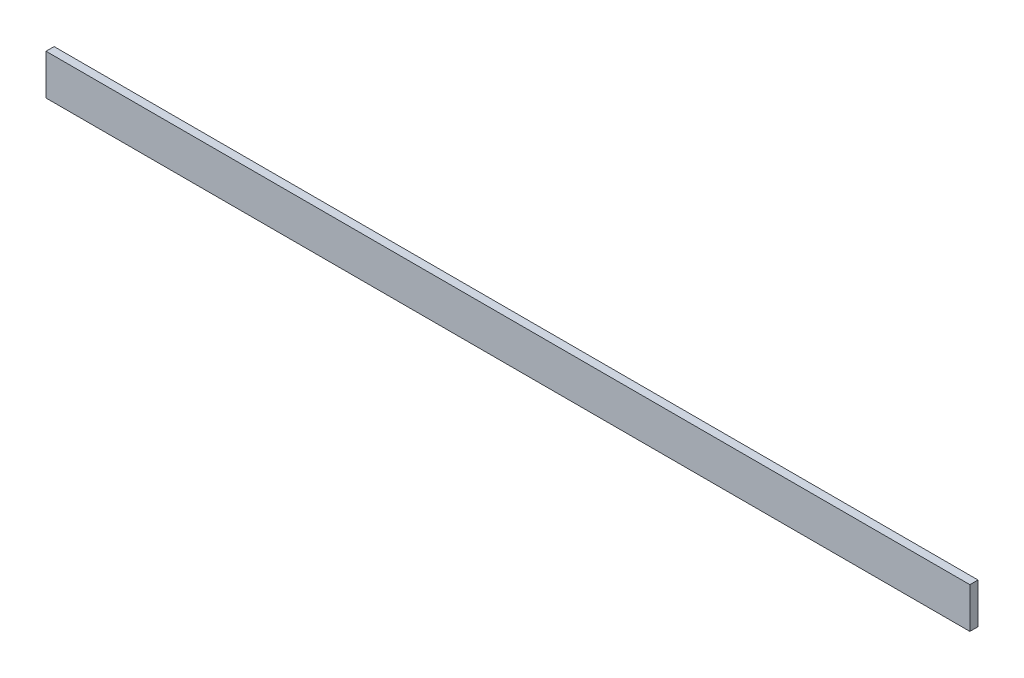
ISO-10303-21;
HEADER;
FILE_DESCRIPTION(('STEP AP214'),'2;1');
FILE_NAME('part.step','',(''),(''),'','','');
FILE_SCHEMA(('AUTOMOTIVE_DESIGN { 1 0 10303 214 1 1 1 1 }'));
ENDSEC;
DATA;
#1=APPLICATION_CONTEXT('core data for automotive mechanical design processes');
#2=APPLICATION_PROTOCOL_DEFINITION('international standard','automotive_design',2000,#1);
#3=PRODUCT_CONTEXT('',#1,'mechanical');
#4=PRODUCT('Part','Part','',(#3));
#5=PRODUCT_RELATED_PRODUCT_CATEGORY('part','',(#4));
#6=PRODUCT_DEFINITION_FORMATION('','',#4);
#7=PRODUCT_DEFINITION_CONTEXT('part definition',#1,'design');
#8=PRODUCT_DEFINITION('design','',#6,#7);
#9=PRODUCT_DEFINITION_SHAPE('','',#8);
#10=(LENGTH_UNIT() NAMED_UNIT(*) SI_UNIT(.MILLI.,.METRE.));
#11=(NAMED_UNIT(*) PLANE_ANGLE_UNIT() SI_UNIT($,.RADIAN.));
#12=(NAMED_UNIT(*) SI_UNIT($,.STERADIAN.) SOLID_ANGLE_UNIT());
#13=UNCERTAINTY_MEASURE_WITH_UNIT(LENGTH_MEASURE(1.E-05),#10,'distance_accuracy_value','');
#14=(GEOMETRIC_REPRESENTATION_CONTEXT(3) GLOBAL_UNCERTAINTY_ASSIGNED_CONTEXT((#13)) GLOBAL_UNIT_ASSIGNED_CONTEXT((#10,
#11,#12)) REPRESENTATION_CONTEXT('',''));
#15=CARTESIAN_POINT('',(0.,0.,0.));
#16=DIRECTION('',(0.,0.,1.));
#17=DIRECTION('',(1.,0.,0.));
#18=AXIS2_PLACEMENT_3D('',#15,#16,#17);
#19=CARTESIAN_POINT('',(57.,-2.5,1.));
#20=DIRECTION('',(-1.,0.,0.));
#21=DIRECTION('',(0.,0.,1.));
#22=AXIS2_PLACEMENT_3D('',#19,#20,#21);
#23=PLANE('',#22);
#24=DIRECTION('',(0.,1.,0.));
#25=VECTOR('',#24,1.);
#26=CARTESIAN_POINT('',(57.,-2.5,0.));
#27=LINE('',#26,#25);
#28=CARTESIAN_POINT('',(57.,-2.5,0.));
#29=VERTEX_POINT('',#28);
#30=CARTESIAN_POINT('',(57.,2.5,0.));
#31=VERTEX_POINT('',#30);
#32=EDGE_CURVE('E107',#29,#31,#27,.T.);
#33=ORIENTED_EDGE('',*,*,#32,.T.);
#34=DIRECTION('',(0.,0.,-1.));
#35=VECTOR('',#34,1.);
#36=CARTESIAN_POINT('',(57.,2.5,1.));
#37=LINE('',#36,#35);
#38=CARTESIAN_POINT('',(57.,2.5,1.));
#39=VERTEX_POINT('',#38);
#40=EDGE_CURVE('E11',#39,#31,#37,.T.);
#41=ORIENTED_EDGE('',*,*,#40,.F.);
#42=DIRECTION('',(0.,1.,0.));
#43=VECTOR('',#42,1.);
#44=CARTESIAN_POINT('',(57.,-2.5,1.));
#45=LINE('',#44,#43);
#46=CARTESIAN_POINT('',(57.,-2.5,1.));
#47=VERTEX_POINT('',#46);
#48=EDGE_CURVE('E91',#47,#39,#45,.T.);
#49=ORIENTED_EDGE('',*,*,#48,.F.);
#50=DIRECTION('',(0.,0.,-1.));
#51=VECTOR('',#50,1.);
#52=CARTESIAN_POINT('',(57.,-2.5,1.));
#53=LINE('',#52,#51);
#54=EDGE_CURVE('E103',#47,#29,#53,.T.);
#55=ORIENTED_EDGE('',*,*,#54,.T.);
#56=EDGE_LOOP('',(#33,#41,#49,#55));
#57=FACE_BOUND('',#56,.T.);
#58=ADVANCED_FACE('F39',(#57),#23,.F.);
#59=CARTESIAN_POINT('',(-57.,2.5,1.));
#60=DIRECTION('',(0.,-1.,0.));
#61=DIRECTION('',(0.,0.,-1.));
#62=AXIS2_PLACEMENT_3D('',#59,#60,#61);
#63=PLANE('',#62);
#64=DIRECTION('',(-1.,0.,0.));
#65=VECTOR('',#64,1.);
#66=CARTESIAN_POINT('',(-57.,2.5,0.));
#67=LINE('',#66,#65);
#68=CARTESIAN_POINT('',(-57.,2.5,0.));
#69=VERTEX_POINT('',#68);
#70=EDGE_CURVE('E96',#31,#69,#67,.T.);
#71=ORIENTED_EDGE('',*,*,#70,.T.);
#72=DIRECTION('',(0.,0.,-1.));
#73=VECTOR('',#72,1.);
#74=CARTESIAN_POINT('',(-57.,2.5,1.));
#75=LINE('',#74,#73);
#76=CARTESIAN_POINT('',(-57.,2.5,1.));
#77=VERTEX_POINT('',#76);
#78=EDGE_CURVE('E48',#77,#69,#75,.T.);
#79=ORIENTED_EDGE('',*,*,#78,.F.);
#80=DIRECTION('',(-1.,0.,0.));
#81=VECTOR('',#80,1.);
#82=CARTESIAN_POINT('',(-57.,2.5,1.));
#83=LINE('',#82,#81);
#84=EDGE_CURVE('E86',#39,#77,#83,.T.);
#85=ORIENTED_EDGE('',*,*,#84,.F.);
#86=ORIENTED_EDGE('',*,*,#40,.T.);
#87=EDGE_LOOP('',(#71,#79,#85,#86));
#88=FACE_BOUND('',#87,.T.);
#89=ADVANCED_FACE('F95',(#88),#63,.F.);
#90=CARTESIAN_POINT('',(-57.,-2.5,1.));
#91=DIRECTION('',(1.,0.,0.));
#92=DIRECTION('',(0.,0.,-1.));
#93=AXIS2_PLACEMENT_3D('',#90,#91,#92);
#94=PLANE('',#93);
#95=DIRECTION('',(0.,-1.,0.));
#96=VECTOR('',#95,1.);
#97=CARTESIAN_POINT('',(-57.,-2.5,0.));
#98=LINE('',#97,#96);
#99=CARTESIAN_POINT('',(-57.,-2.5,0.));
#100=VERTEX_POINT('',#99);
#101=EDGE_CURVE('E73',#69,#100,#98,.T.);
#102=ORIENTED_EDGE('',*,*,#101,.T.);
#103=DIRECTION('',(0.,0.,-1.));
#104=VECTOR('',#103,1.);
#105=CARTESIAN_POINT('',(-57.,-2.5,1.));
#106=LINE('',#105,#104);
#107=CARTESIAN_POINT('',(-57.,-2.5,1.));
#108=VERTEX_POINT('',#107);
#109=EDGE_CURVE('E98',#108,#100,#106,.T.);
#110=ORIENTED_EDGE('',*,*,#109,.F.);
#111=DIRECTION('',(0.,-1.,0.));
#112=VECTOR('',#111,1.);
#113=CARTESIAN_POINT('',(-57.,-2.5,1.));
#114=LINE('',#113,#112);
#115=EDGE_CURVE('E89',#77,#108,#114,.T.);
#116=ORIENTED_EDGE('',*,*,#115,.F.);
#117=ORIENTED_EDGE('',*,*,#78,.T.);
#118=EDGE_LOOP('',(#102,#110,#116,#117));
#119=FACE_BOUND('',#118,.T.);
#120=ADVANCED_FACE('F99',(#119),#94,.F.);
#121=CARTESIAN_POINT('',(-57.,-2.5,1.));
#122=DIRECTION('',(0.,1.,0.));
#123=DIRECTION('',(0.,0.,1.));
#124=AXIS2_PLACEMENT_3D('',#121,#122,#123);
#125=PLANE('',#124);
#126=DIRECTION('',(1.,0.,0.));
#127=VECTOR('',#126,1.);
#128=CARTESIAN_POINT('',(-57.,-2.5,0.));
#129=LINE('',#128,#127);
#130=EDGE_CURVE('E79',#100,#29,#129,.T.);
#131=ORIENTED_EDGE('',*,*,#130,.T.);
#132=ORIENTED_EDGE('',*,*,#54,.F.);
#133=DIRECTION('',(1.,0.,0.));
#134=VECTOR('',#133,1.);
#135=CARTESIAN_POINT('',(-57.,-2.5,1.));
#136=LINE('',#135,#134);
#137=EDGE_CURVE('E56',#108,#47,#136,.T.);
#138=ORIENTED_EDGE('',*,*,#137,.F.);
#139=ORIENTED_EDGE('',*,*,#109,.T.);
#140=EDGE_LOOP('',(#131,#132,#138,#139));
#141=FACE_BOUND('',#140,.T.);
#142=ADVANCED_FACE('F120',(#141),#125,.F.);
#143=CARTESIAN_POINT('',(0.,0.,1.));
#144=DIRECTION('',(0.,0.,-1.));
#145=DIRECTION('',(-1.,0.,0.));
#146=AXIS2_PLACEMENT_3D('',#143,#144,#145);
#147=PLANE('',#146);
#148=ORIENTED_EDGE('',*,*,#48,.T.);
#149=ORIENTED_EDGE('',*,*,#84,.T.);
#150=ORIENTED_EDGE('',*,*,#115,.T.);
#151=ORIENTED_EDGE('',*,*,#137,.T.);
#152=EDGE_LOOP('',(#148,#149,#150,#151));
#153=FACE_BOUND('',#152,.T.);
#154=ADVANCED_FACE('F87',(#153),#147,.F.);
#155=CARTESIAN_POINT('',(0.,0.,0.));
#156=DIRECTION('',(0.,0.,-1.));
#157=DIRECTION('',(-1.,0.,0.));
#158=AXIS2_PLACEMENT_3D('',#155,#156,#157);
#159=PLANE('',#158);
#160=ORIENTED_EDGE('',*,*,#32,.F.);
#161=ORIENTED_EDGE('',*,*,#130,.F.);
#162=ORIENTED_EDGE('',*,*,#101,.F.);
#163=ORIENTED_EDGE('',*,*,#70,.F.);
#164=EDGE_LOOP('',(#160,#161,#162,#163));
#165=FACE_BOUND('',#164,.T.);
#166=ADVANCED_FACE('F123',(#165),#159,.T.);
#167=CLOSED_SHELL('',(#58,#89,#120,#142,#154,#166));
#168=MANIFOLD_SOLID_BREP('B2',#167);
#169=ADVANCED_BREP_SHAPE_REPRESENTATION('',(#18,#168),#14);
#170=SHAPE_DEFINITION_REPRESENTATION(#9,#169);
ENDSEC;
END-ISO-10303-21;
